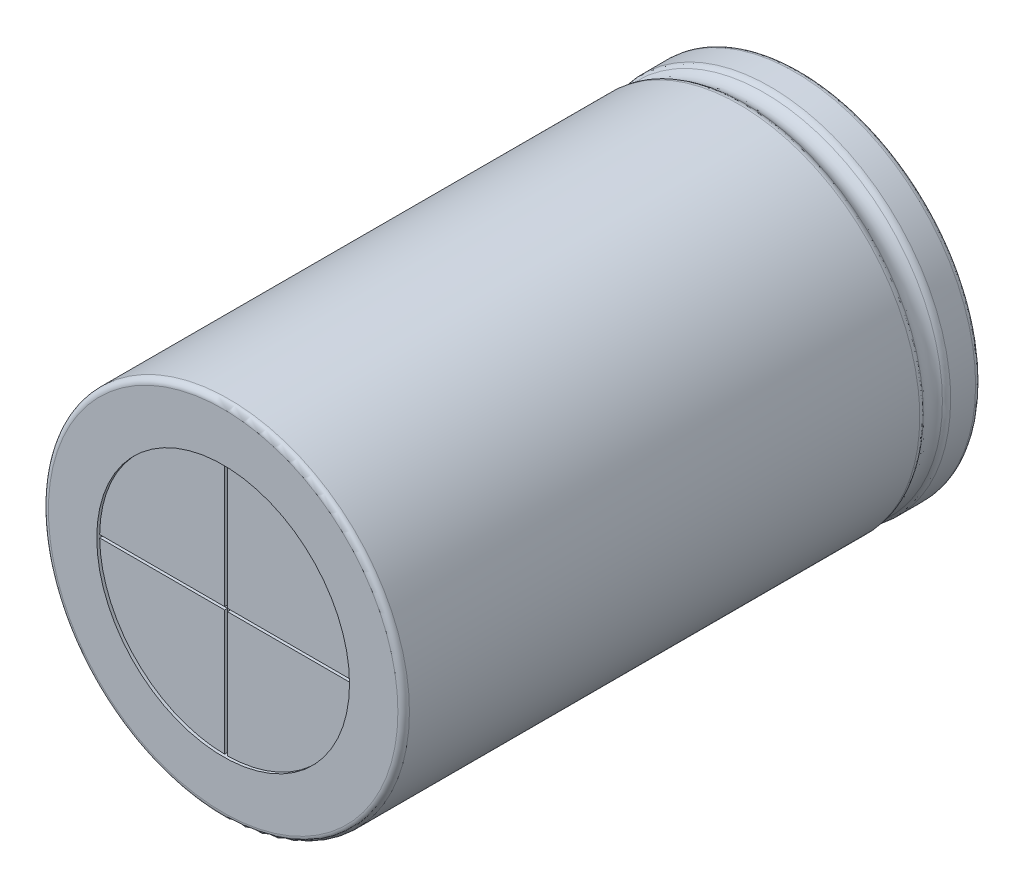
ISO-10303-21;
HEADER;
FILE_DESCRIPTION(('STEP AP214'),'2;1');
FILE_NAME('part.step','',(''),(''),'','','');
FILE_SCHEMA(('AUTOMOTIVE_DESIGN { 1 0 10303 214 1 1 1 1 }'));
ENDSEC;
DATA;
#1=APPLICATION_CONTEXT('core data for automotive mechanical design processes');
#2=APPLICATION_PROTOCOL_DEFINITION('international standard','automotive_design',2000,#1);
#3=PRODUCT_CONTEXT('',#1,'mechanical');
#4=PRODUCT('Part','Part','',(#3));
#5=PRODUCT_RELATED_PRODUCT_CATEGORY('part','',(#4));
#6=PRODUCT_DEFINITION_FORMATION('','',#4);
#7=PRODUCT_DEFINITION_CONTEXT('part definition',#1,'design');
#8=PRODUCT_DEFINITION('design','',#6,#7);
#9=PRODUCT_DEFINITION_SHAPE('','',#8);
#10=(LENGTH_UNIT() NAMED_UNIT(*) SI_UNIT(.MILLI.,.METRE.));
#11=(NAMED_UNIT(*) PLANE_ANGLE_UNIT() SI_UNIT($,.RADIAN.));
#12=(NAMED_UNIT(*) SI_UNIT($,.STERADIAN.) SOLID_ANGLE_UNIT());
#13=UNCERTAINTY_MEASURE_WITH_UNIT(LENGTH_MEASURE(1.E-05),#10,'distance_accuracy_value','');
#14=(GEOMETRIC_REPRESENTATION_CONTEXT(3) GLOBAL_UNCERTAINTY_ASSIGNED_CONTEXT((#13)) GLOBAL_UNIT_ASSIGNED_CONTEXT((#10,
#11,#12)) REPRESENTATION_CONTEXT('',''));
#15=CARTESIAN_POINT('',(0.,0.,0.));
#16=DIRECTION('',(0.,0.,1.));
#17=DIRECTION('',(1.,0.,0.));
#18=AXIS2_PLACEMENT_3D('',#15,#16,#17);
#19=CARTESIAN_POINT('',(5.,0.,-1.9));
#20=DIRECTION('',(0.,0.,1.));
#21=DIRECTION('',(1.,0.,0.));
#22=AXIS2_PLACEMENT_3D('',#19,#20,#21);
#23=PLANE('',#22);
#24=CARTESIAN_POINT('',(5.,0.,-1.9));
#25=DIRECTION('',(0.,0.,1.));
#26=DIRECTION('',(-1.,0.,0.));
#27=AXIS2_PLACEMENT_3D('',#24,#25,#26);
#28=CIRCLE('',#27,0.3);
#29=CARTESIAN_POINT('',(4.7,0.,-1.9));
#30=VERTEX_POINT('',#29);
#31=EDGE_CURVE('E30',#30,#30,#28,.T.);
#32=ORIENTED_EDGE('',*,*,#31,.F.);
#33=EDGE_LOOP('',(#32));
#34=FACE_BOUND('',#33,.T.);
#35=ADVANCED_FACE('F17',(#34),#23,.F.);
#36=CARTESIAN_POINT('',(5.,0.,0.3));
#37=DIRECTION('',(0.,0.,1.));
#38=DIRECTION('',(-1.,0.,0.));
#39=AXIS2_PLACEMENT_3D('',#36,#37,#38);
#40=CYLINDRICAL_SURFACE('',#39,0.3);
#41=CARTESIAN_POINT('',(5.,0.,0.2));
#42=DIRECTION('',(0.,0.,1.));
#43=DIRECTION('',(-1.,0.,0.));
#44=AXIS2_PLACEMENT_3D('',#41,#42,#43);
#45=CIRCLE('',#44,0.3);
#46=CARTESIAN_POINT('',(4.7,0.,0.2));
#47=VERTEX_POINT('',#46);
#48=EDGE_CURVE('E261',#47,#47,#45,.T.);
#49=ORIENTED_EDGE('',*,*,#48,.F.);
#50=DIRECTION('',(0.,0.,-1.));
#51=VECTOR('',#50,1.);
#52=CARTESIAN_POINT('',(4.7,0.,0.3));
#53=LINE('',#52,#51);
#54=EDGE_CURVE('E10',#47,#30,#53,.T.);
#55=ORIENTED_EDGE('',*,*,#54,.T.);
#56=ORIENTED_EDGE('',*,*,#31,.T.);
#57=ORIENTED_EDGE('',*,*,#54,.F.);
#58=EDGE_LOOP('',(#49,#55,#56,#57));
#59=FACE_BOUND('',#58,.T.);
#60=ADVANCED_FACE('F326',(#59),#40,.T.);
#61=CARTESIAN_POINT('',(2.5,0.,0.2));
#62=DIRECTION('',(0.,0.,1.));
#63=DIRECTION('',(1.,0.,0.));
#64=AXIS2_PLACEMENT_3D('',#61,#62,#63);
#65=PLANE('',#64);
#66=CARTESIAN_POINT('',(2.5,0.,0.2));
#67=DIRECTION('',(0.,0.,1.));
#68=DIRECTION('',(1.,0.,0.));
#69=AXIS2_PLACEMENT_3D('',#66,#67,#68);
#70=CIRCLE('',#69,4.375);
#71=CARTESIAN_POINT('',(6.875,0.,0.2));
#72=VERTEX_POINT('',#71);
#73=EDGE_CURVE('E270',#72,#72,#70,.T.);
#74=ORIENTED_EDGE('',*,*,#73,.F.);
#75=EDGE_LOOP('',(#74));
#76=FACE_BOUND('',#75,.T.);
#77=ORIENTED_EDGE('',*,*,#48,.T.);
#78=EDGE_LOOP('',(#77));
#79=FACE_BOUND('',#78,.T.);
#80=CARTESIAN_POINT('',(0.,0.,0.2));
#81=DIRECTION('',(0.,0.,1.));
#82=DIRECTION('',(-1.,0.,0.));
#83=AXIS2_PLACEMENT_3D('',#80,#81,#82);
#84=CIRCLE('',#83,0.3);
#85=CARTESIAN_POINT('',(-0.3,0.,0.2));
#86=VERTEX_POINT('',#85);
#87=EDGE_CURVE('E258',#86,#86,#84,.T.);
#88=ORIENTED_EDGE('',*,*,#87,.T.);
#89=EDGE_LOOP('',(#88));
#90=FACE_BOUND('',#89,.T.);
#91=ADVANCED_FACE('F329',(#76,#79,#90),#65,.F.);
#92=CARTESIAN_POINT('',(2.5,0.,0.3));
#93=DIRECTION('',(0.,0.,-1.));
#94=DIRECTION('',(1.,0.,0.));
#95=AXIS2_PLACEMENT_3D('',#92,#93,#94);
#96=CYLINDRICAL_SURFACE('',#95,4.375);
#97=DIRECTION('',(0.,0.,-1.));
#98=VECTOR('',#97,1.);
#99=CARTESIAN_POINT('',(6.875,0.,0.3));
#100=LINE('',#99,#98);
#101=CARTESIAN_POINT('',(6.875,0.,0.));
#102=VERTEX_POINT('',#101);
#103=EDGE_CURVE('E262',#72,#102,#100,.T.);
#104=ORIENTED_EDGE('',*,*,#103,.T.);
#105=CARTESIAN_POINT('',(2.5,0.,0.));
#106=DIRECTION('',(0.,0.,-1.));
#107=DIRECTION('',(1.,0.,0.));
#108=AXIS2_PLACEMENT_3D('',#105,#106,#107);
#109=CIRCLE('',#108,4.375);
#110=EDGE_CURVE('E798',#102,#102,#109,.T.);
#111=ORIENTED_EDGE('',*,*,#110,.T.);
#112=ORIENTED_EDGE('',*,*,#103,.F.);
#113=ORIENTED_EDGE('',*,*,#73,.T.);
#114=EDGE_LOOP('',(#104,#111,#112,#113));
#115=FACE_BOUND('',#114,.T.);
#116=ADVANCED_FACE('F380',(#115),#96,.F.);
#117=CARTESIAN_POINT('',(0.,0.,0.3));
#118=DIRECTION('',(0.,0.,1.));
#119=DIRECTION('',(-1.,0.,0.));
#120=AXIS2_PLACEMENT_3D('',#117,#118,#119);
#121=CYLINDRICAL_SURFACE('',#120,0.3);
#122=ORIENTED_EDGE('',*,*,#87,.F.);
#123=DIRECTION('',(0.,0.,-1.));
#124=VECTOR('',#123,1.);
#125=CARTESIAN_POINT('',(-0.3,0.,0.3));
#126=LINE('',#125,#124);
#127=CARTESIAN_POINT('',(-0.3,0.,-2.));
#128=VERTEX_POINT('',#127);
#129=EDGE_CURVE('E266',#86,#128,#126,.T.);
#130=ORIENTED_EDGE('',*,*,#129,.T.);
#131=CARTESIAN_POINT('',(0.,0.,-2.));
#132=DIRECTION('',(0.,0.,1.));
#133=DIRECTION('',(-1.,0.,0.));
#134=AXIS2_PLACEMENT_3D('',#131,#132,#133);
#135=CIRCLE('',#134,0.3);
#136=EDGE_CURVE('E271',#128,#128,#135,.T.);
#137=ORIENTED_EDGE('',*,*,#136,.T.);
#138=ORIENTED_EDGE('',*,*,#129,.F.);
#139=EDGE_LOOP('',(#122,#130,#137,#138));
#140=FACE_BOUND('',#139,.T.);
#141=ADVANCED_FACE('F362',(#140),#121,.T.);
#142=CARTESIAN_POINT('',(2.5,0.,0.));
#143=DIRECTION('',(0.,0.,-1.));
#144=DIRECTION('',(0.,-1.,0.));
#145=AXIS2_PLACEMENT_3D('',#142,#143,#144);
#146=PLANE('',#145);
#147=ORIENTED_EDGE('',*,*,#110,.F.);
#148=EDGE_LOOP('',(#147));
#149=FACE_BOUND('',#148,.T.);
#150=CARTESIAN_POINT('',(2.5,0.,0.));
#151=DIRECTION('',(0.,0.,-1.));
#152=DIRECTION('',(1.,0.,0.));
#153=AXIS2_PLACEMENT_3D('',#150,#151,#152);
#154=CIRCLE('',#153,6.05);
#155=CARTESIAN_POINT('',(8.55,0.,0.));
#156=VERTEX_POINT('',#155);
#157=EDGE_CURVE('E812',#156,#156,#154,.T.);
#158=ORIENTED_EDGE('',*,*,#157,.T.);
#159=EDGE_LOOP('',(#158));
#160=FACE_BOUND('',#159,.T.);
#161=ADVANCED_FACE('F346',(#149,#160),#146,.T.);
#162=CARTESIAN_POINT('',(0.,0.,-2.));
#163=DIRECTION('',(0.,0.,1.));
#164=DIRECTION('',(1.,0.,0.));
#165=AXIS2_PLACEMENT_3D('',#162,#163,#164);
#166=PLANE('',#165);
#167=ORIENTED_EDGE('',*,*,#136,.F.);
#168=EDGE_LOOP('',(#167));
#169=FACE_BOUND('',#168,.T.);
#170=ADVANCED_FACE('F306',(#169),#166,.F.);
#171=CARTESIAN_POINT('',(8.55,0.,0.));
#172=CARTESIAN_POINT('',(8.66715728752538,0.,0.));
#173=CARTESIAN_POINT('',(8.75000000000001,0.,0.0828427124746187));
#174=CARTESIAN_POINT('',(8.75,0.,0.2));
#175=(BOUNDED_CURVE() B_SPLINE_CURVE(3,(#171,#172,#173,#174),.UNSPECIFIED.,.F.,
.F.) B_SPLINE_CURVE_WITH_KNOTS((4,4),(0.,1.),
.UNSPECIFIED.) CURVE() GEOMETRIC_REPRESENTATION_ITEM() RATIONAL_B_SPLINE_CURVE((1.,
0.804737854124364,0.804737854124364,1.)) REPRESENTATION_ITEM(''));
#176=CARTESIAN_POINT('',(2.5,0.,0.));
#177=DIRECTION('',(0.,0.,1.));
#178=AXIS1_PLACEMENT('',#176,#177);
#179=SURFACE_OF_REVOLUTION('',#175,#178);
#180=CARTESIAN_POINT('',(8.55,0.,0.2));
#181=DIRECTION('',(0.,-1.,0.));
#182=DIRECTION('',(0.,0.,-1.));
#183=AXIS2_PLACEMENT_3D('',#180,#181,#182);
#184=CIRCLE('',#183,0.2);
#185=CARTESIAN_POINT('',(8.75,0.,0.2));
#186=VERTEX_POINT('',#185);
#187=EDGE_CURVE('E808',#156,#186,#184,.T.);
#188=ORIENTED_EDGE('',*,*,#187,.T.);
#189=CARTESIAN_POINT('',(2.5,0.,0.2));
#190=DIRECTION('',(0.,0.,-1.));
#191=DIRECTION('',(1.,0.,0.));
#192=AXIS2_PLACEMENT_3D('',#189,#190,#191);
#193=CIRCLE('',#192,6.25);
#194=EDGE_CURVE('E813',#186,#186,#193,.T.);
#195=ORIENTED_EDGE('',*,*,#194,.T.);
#196=ORIENTED_EDGE('',*,*,#187,.F.);
#197=ORIENTED_EDGE('',*,*,#157,.F.);
#198=EDGE_LOOP('',(#188,#195,#196,#197));
#199=FACE_BOUND('',#198,.T.);
#200=ADVANCED_FACE('F302',(#199),#179,.T.);
#201=CARTESIAN_POINT('',(2.5,0.,0.2));
#202=DIRECTION('',(0.,0.,1.));
#203=DIRECTION('',(1.,0.,0.));
#204=AXIS2_PLACEMENT_3D('',#201,#202,#203);
#205=CYLINDRICAL_SURFACE('',#204,6.25);
#206=CARTESIAN_POINT('',(8.75,0.,1.064979142851));
#207=CARTESIAN_POINT('',(8.750000000002,-2.764417237131,1.064979142851));
#208=CARTESIAN_POINT('',(7.433450299616,-5.587680207856,1.064979142851));
#209=CARTESIAN_POINT('',(4.70751089804,-7.733925513798,1.064979142851));
#210=CARTESIAN_POINT('',(0.989525682896,-8.439508903971,1.064979142851));
#211=CARTESIAN_POINT('',(-2.86187936145,-7.042866187248,1.064979142851));
#212=CARTESIAN_POINT('',(-5.445545223467,-4.277607477121,1.064979142852));
#213=CARTESIAN_POINT('',(-7.07999725837,3.246155275231E-11,1.064979142851));
#214=CARTESIAN_POINT('',(-5.44554522347,4.277607477066,1.064979142852));
#215=CARTESIAN_POINT('',(-2.86187936145,7.042866187284,1.064979142851));
#216=CARTESIAN_POINT('',(0.989525682902,8.439508903953,1.064979142851));
#217=CARTESIAN_POINT('',(4.707510898034,7.733925513807,1.064979142851));
#218=CARTESIAN_POINT('',(7.43345029962,5.587680207852,1.064979142851));
#219=CARTESIAN_POINT('',(8.750000000001,2.764417237132,1.064979142851));
#220=CARTESIAN_POINT('',(8.75,0.,1.064979142851));
#221=(BOUNDED_CURVE() B_SPLINE_CURVE(14,(#206,#207,#208,#209,#210,#211,#212,#213,#214,#215,#216,
#217,#218,#219,#220),.UNSPECIFIED.,.T.,.F.) B_SPLINE_CURVE_WITH_KNOTS((15,15),(0.,
39.269908169872),
.UNSPECIFIED.) CURVE() GEOMETRIC_REPRESENTATION_ITEM() RATIONAL_B_SPLINE_CURVE((1.,1.,1.,1.,1.,
1.,1.,1.,1.,1.,1.,1.,1.,1.,1.)) REPRESENTATION_ITEM(''));
#222=CARTESIAN_POINT('',(8.75,0.,1.064979142851));
#223=VERTEX_POINT('',#222);
#224=EDGE_CURVE('E254',#223,#223,#221,.T.);
#225=ORIENTED_EDGE('',*,*,#224,.T.);
#226=DIRECTION('',(0.,0.,1.));
#227=VECTOR('',#226,1.);
#228=CARTESIAN_POINT('',(8.75,0.,0.2));
#229=LINE('',#228,#227);
#230=EDGE_CURVE('E282',#186,#223,#229,.T.);
#231=ORIENTED_EDGE('',*,*,#230,.F.);
#232=ORIENTED_EDGE('',*,*,#194,.F.);
#233=ORIENTED_EDGE('',*,*,#230,.T.);
#234=EDGE_LOOP('',(#225,#231,#232,#233));
#235=FACE_BOUND('',#234,.T.);
#236=ADVANCED_FACE('F305',(#235),#205,.T.);
#237=CARTESIAN_POINT('',(8.75,0.,1.064979142851));
#238=CARTESIAN_POINT('',(8.750000000002,-2.764417237131,1.064979142851));
#239=CARTESIAN_POINT('',(7.433450299616,-5.587680207856,1.064979142851));
#240=CARTESIAN_POINT('',(4.70751089804,-7.733925513798,1.064979142851));
#241=CARTESIAN_POINT('',(0.989525682896,-8.439508903971,1.064979142851));
#242=CARTESIAN_POINT('',(-2.86187936145,-7.042866187248,1.064979142851));
#243=CARTESIAN_POINT('',(-5.445545223467,-4.277607477121,1.064979142852));
#244=CARTESIAN_POINT('',(-7.07999725837,3.246155275231E-11,1.064979142851));
#245=CARTESIAN_POINT('',(-5.44554522347,4.277607477066,1.064979142852));
#246=CARTESIAN_POINT('',(-2.86187936145,7.04286618728401,1.064979142851));
#247=CARTESIAN_POINT('',(0.989525682902,8.439508903953,1.064979142851));
#248=CARTESIAN_POINT('',(4.707510898034,7.733925513807,1.064979142851));
#249=CARTESIAN_POINT('',(7.43345029962,5.587680207852,1.064979142851));
#250=CARTESIAN_POINT('',(8.750000000001,2.764417237132,1.064979142851));
#251=CARTESIAN_POINT('',(8.75,0.,1.064979142851));
#252=CARTESIAN_POINT('',(8.75,0.,1.182962690499));
#253=CARTESIAN_POINT('',(8.750000000003,-2.764417237131,1.182962690499));
#254=CARTESIAN_POINT('',(7.433450299614,-5.58768020785301,1.182962690499));
#255=CARTESIAN_POINT('',(4.707510898044,-7.733925513809,1.182962690499));
#256=CARTESIAN_POINT('',(0.9895256829,-8.439508903947,1.182962690499));
#257=CARTESIAN_POINT('',(-2.861879361473,-7.04286618728,1.182962690499));
#258=CARTESIAN_POINT('',(-5.445545223421,-4.2776074771,1.1829626905));
#259=CARTESIAN_POINT('',(-7.079997258428,4.280073278527E-11,1.182962690499));
#260=CARTESIAN_POINT('',(-5.44554522343,4.277607477027,1.1829626905));
#261=CARTESIAN_POINT('',(-2.861879361466,7.042866187327,1.182962690499));
#262=CARTESIAN_POINT('',(0.989525682901001,8.439508903922,1.182962690499));
#263=CARTESIAN_POINT('',(4.707510898039,7.733925513821,1.182962690499));
#264=CARTESIAN_POINT('',(7.433450299616,5.587680207848,1.182962690499));
#265=CARTESIAN_POINT('',(8.750000000002,2.764417237132,1.182962690499));
#266=CARTESIAN_POINT('',(8.75,0.,1.182962690499));
#267=CARTESIAN_POINT('',(8.669629897377,0.,1.269338405373));
#268=CARTESIAN_POINT('',(8.669629897379,-2.728868997603,1.269338405373));
#269=CARTESIAN_POINT('',(7.370009994517,-5.515827018781,1.269338405373));
#270=CARTESIAN_POINT('',(4.679124037655,-7.634473291834,1.269338405373));
#271=CARTESIAN_POINT('',(1.008949199032,-8.33098343251801,1.269338405373));
#272=CARTESIAN_POINT('',(-2.792929794315,-6.952300446695,1.269338405372));
#273=CARTESIAN_POINT('',(-5.343371737881,-4.222600796868,1.269338405374));
#274=CARTESIAN_POINT('',(-6.956806000305,9.793981203629E-11,1.269338405371));
#275=CARTESIAN_POINT('',(-5.343371737887,4.222600796693,1.269338405374));
#276=CARTESIAN_POINT('',(-2.79292979431,6.952300446821,1.269338405372));
#277=CARTESIAN_POINT('',(1.008949199033,8.330983432445,1.269338405373));
#278=CARTESIAN_POINT('',(4.679124037651,7.634473291869,1.269338405373));
#279=CARTESIAN_POINT('',(7.370009994519,5.515827018768,1.269338405373));
#280=CARTESIAN_POINT('',(8.669629897378,2.728868997606,1.269338405373));
#281=CARTESIAN_POINT('',(8.669629897377,0.,1.269338405373));
#282=(BOUNDED_SURFACE() B_SPLINE_SURFACE(2,14,((#237,#238,#239,#240,#241,#242,#243,#244,#245,
#246,#247,#248,#249,#250,#251),(#252,#253,#254,#255,#256,#257,#258,#259,#260,#261,#262,#263,
#264,#265,#266),(#267,#268,#269,#270,#271,#272,#273,#274,#275,#276,#277,#278,#279,#280,#281)),
.UNSPECIFIED.,.F.,.T.,.F.) B_SPLINE_SURFACE_WITH_KNOTS((3,3),(15,15),(0.,39.269908169872),(0.,
39.269908169872),.UNSPECIFIED.) GEOMETRIC_REPRESENTATION_ITEM() RATIONAL_B_SPLINE_SURFACE(((1.,
1.,1.,0.999999999999,1.000000000003,0.999999999996,1.000000000004,0.999999999996,1.000000000003,
0.999999999998,1.000000000001,1.,1.,1.,1.),(0.93061798229,0.930617982289,0.930617982291,
0.930617982287,0.930617982295,0.930617982282,0.9306179823,0.930617982279,0.930617982299,
0.930617982283,0.930617982293,0.930617982288,0.93061798229,0.93061798229,0.93061798229),(1.,1.,
1.,0.999999999999,1.000000000003,0.999999999996,1.000000000004,0.999999999996,1.000000000003,
0.999999999998,1.000000000001,1.,1.,1.,1.))) REPRESENTATION_ITEM('') SURFACE());
#283=CARTESIAN_POINT('',(8.75,0.,1.064979142851));
#284=CARTESIAN_POINT('',(8.75,0.,1.182962690499));
#285=CARTESIAN_POINT('',(8.669629897377,0.,1.269338405373));
#286=(BOUNDED_CURVE() B_SPLINE_CURVE(2,(#283,#284,#285),.UNSPECIFIED.,.F.,
.F.) B_SPLINE_CURVE_WITH_KNOTS((3,3),(0.,39.269908169872),
.UNSPECIFIED.) CURVE() GEOMETRIC_REPRESENTATION_ITEM() RATIONAL_B_SPLINE_CURVE((1.,
0.93061798229,1.)) REPRESENTATION_ITEM(''));
#287=CARTESIAN_POINT('',(8.669629897377,0.,1.269338405373));
#288=VERTEX_POINT('',#287);
#289=EDGE_CURVE('E285',#223,#288,#286,.T.);
#290=CARTESIAN_POINT('',(8.669629897377,0.,1.269338405373));
#291=CARTESIAN_POINT('',(8.669629897379,-2.728868997603,1.269338405373));
#292=CARTESIAN_POINT('',(7.370009994517,-5.515827018781,1.269338405373));
#293=CARTESIAN_POINT('',(4.679124037655,-7.634473291834,1.269338405373));
#294=CARTESIAN_POINT('',(1.008949199032,-8.330983432518,1.269338405373));
#295=CARTESIAN_POINT('',(-2.792929794315,-6.952300446695,1.269338405372));
#296=CARTESIAN_POINT('',(-5.343371737881,-4.222600796868,1.269338405374));
#297=CARTESIAN_POINT('',(-6.956806000305,9.793981203629E-11,1.269338405371));
#298=CARTESIAN_POINT('',(-5.343371737887,4.222600796693,1.269338405374));
#299=CARTESIAN_POINT('',(-2.79292979431,6.952300446821,1.269338405372));
#300=CARTESIAN_POINT('',(1.008949199033,8.330983432445,1.269338405373));
#301=CARTESIAN_POINT('',(4.679124037651,7.634473291869,1.269338405373));
#302=CARTESIAN_POINT('',(7.370009994519,5.515827018768,1.269338405373));
#303=CARTESIAN_POINT('',(8.669629897378,2.728868997606,1.269338405373));
#304=CARTESIAN_POINT('',(8.669629897377,0.,1.269338405373));
#305=(BOUNDED_CURVE() B_SPLINE_CURVE(14,(#290,#291,#292,#293,#294,#295,#296,#297,#298,#299,#300,
#301,#302,#303,#304),.UNSPECIFIED.,.T.,.F.) B_SPLINE_CURVE_WITH_KNOTS((15,15),(0.,
39.269908169872),
.UNSPECIFIED.) CURVE() GEOMETRIC_REPRESENTATION_ITEM() RATIONAL_B_SPLINE_CURVE((1.,1.,1.,1.,1.,
1.,1.,1.,1.,1.,1.,1.,1.,1.,1.)) REPRESENTATION_ITEM(''));
#306=EDGE_CURVE('E829',#288,#288,#305,.T.);
#307=ORIENTED_EDGE('',*,*,#289,.T.);
#308=ORIENTED_EDGE('',*,*,#306,.T.);
#309=ORIENTED_EDGE('',*,*,#289,.F.);
#310=ORIENTED_EDGE('',*,*,#224,.F.);
#311=EDGE_LOOP('',(#307,#308,#309,#310));
#312=FACE_BOUND('',#311,.T.);
#313=ADVANCED_FACE('F371',(#312),#282,.T.);
#314=CARTESIAN_POINT('',(8.67262203769535,0.,1.26615157379086));
#315=CARTESIAN_POINT('',(8.48532955396172,0.,1.46383932245703));
#316=CARTESIAN_POINT('',(8.48532955396171,0.,1.73616067754291));
#317=CARTESIAN_POINT('',(8.67262203769531,0.,1.93384842620911));
#318=(BOUNDED_CURVE() B_SPLINE_CURVE(3,(#314,#315,#316,#317),.UNSPECIFIED.,.F.,
.F.) B_SPLINE_CURVE_WITH_KNOTS((4,4),(0.,1.),
.UNSPECIFIED.) CURVE() GEOMETRIC_REPRESENTATION_ITEM() RATIONAL_B_SPLINE_CURVE((1.,
0.817290356838013,0.817290356838013,1.)) REPRESENTATION_ITEM(''));
#319=CARTESIAN_POINT('',(2.5,0.,0.));
#320=DIRECTION('',(0.,0.,1.));
#321=AXIS1_PLACEMENT('',#319,#320);
#322=SURFACE_OF_REVOLUTION('',#318,#321);
#323=CARTESIAN_POINT('',(8.669629897377,0.,1.930661594627));
#324=CARTESIAN_POINT('',(8.669629897378,-2.728868997603,1.930661594627));
#325=CARTESIAN_POINT('',(7.37000999452,-5.515827018781,1.930661594627));
#326=CARTESIAN_POINT('',(4.679124037647,-7.634473291834,1.930661594627));
#327=CARTESIAN_POINT('',(1.008949199049,-8.330983432516,1.930661594627));
#328=CARTESIAN_POINT('',(-2.792929794344,-6.952300446701,1.930661594628));
#329=CARTESIAN_POINT('',(-5.343371737842,-4.222600796857,1.930661594627));
#330=CARTESIAN_POINT('',(-6.956806000346,8.190108613334E-11,1.930661594628));
#331=CARTESIAN_POINT('',(-5.343371737851,4.222600796711,1.930661594627));
#332=CARTESIAN_POINT('',(-2.792929794336,6.952300446804,1.930661594628));
#333=CARTESIAN_POINT('',(1.008949199048,8.330983432457,1.930661594627));
#334=CARTESIAN_POINT('',(4.679124037644,7.634473291862,1.930661594627));
#335=CARTESIAN_POINT('',(7.370009994522,5.51582701877,1.930661594627));
#336=CARTESIAN_POINT('',(8.669629897377,2.728868997606,1.930661594627));
#337=CARTESIAN_POINT('',(8.669629897377,0.,1.930661594627));
#338=(BOUNDED_CURVE() B_SPLINE_CURVE(14,(#323,#324,#325,#326,#327,#328,#329,#330,#331,#332,#333,
#334,#335,#336,#337),.UNSPECIFIED.,.T.,.F.) B_SPLINE_CURVE_WITH_KNOTS((15,15),(0.,
39.269908169872),
.UNSPECIFIED.) CURVE() GEOMETRIC_REPRESENTATION_ITEM() RATIONAL_B_SPLINE_CURVE((1.,1.,1.,1.,1.,
1.,1.,1.,1.,1.,1.,1.,1.,1.,1.)) REPRESENTATION_ITEM(''));
#339=CARTESIAN_POINT('',(8.669629897377,0.,1.930661594627));
#340=VERTEX_POINT('',#339);
#341=EDGE_CURVE('E289',#340,#340,#338,.T.);
#342=ORIENTED_EDGE('',*,*,#341,.T.);
#343=CARTESIAN_POINT('',(9.025,0.,1.6));
#344=DIRECTION('',(0.,1.,0.));
#345=DIRECTION('',(-0.566528822887193,0.,-0.82404192419928));
#346=AXIS2_PLACEMENT_3D('',#343,#344,#345);
#347=CIRCLE('',#346,0.485412195974);
#348=EDGE_CURVE('E286',#288,#340,#347,.T.);
#349=ORIENTED_EDGE('',*,*,#348,.F.);
#350=ORIENTED_EDGE('',*,*,#306,.F.);
#351=ORIENTED_EDGE('',*,*,#348,.T.);
#352=EDGE_LOOP('',(#342,#349,#350,#351));
#353=FACE_BOUND('',#352,.T.);
#354=ADVANCED_FACE('F19',(#353),#322,.T.);
#355=CARTESIAN_POINT('',(8.669629897377,0.,1.930661594627));
#356=CARTESIAN_POINT('',(8.669629897378,-2.728868997603,1.930661594627));
#357=CARTESIAN_POINT('',(7.37000999452,-5.515827018781,1.930661594627));
#358=CARTESIAN_POINT('',(4.679124037647,-7.634473291834,1.930661594627));
#359=CARTESIAN_POINT('',(1.008949199049,-8.330983432516,1.930661594627));
#360=CARTESIAN_POINT('',(-2.792929794344,-6.952300446701,1.930661594628));
#361=CARTESIAN_POINT('',(-5.343371737842,-4.222600796857,1.930661594627));
#362=CARTESIAN_POINT('',(-6.956806000346,8.190108613334E-11,1.930661594628));
#363=CARTESIAN_POINT('',(-5.343371737851,4.222600796711,1.930661594627));
#364=CARTESIAN_POINT('',(-2.792929794336,6.952300446804,1.930661594628));
#365=CARTESIAN_POINT('',(1.008949199048,8.330983432457,1.930661594627));
#366=CARTESIAN_POINT('',(4.679124037644,7.634473291862,1.930661594627));
#367=CARTESIAN_POINT('',(7.370009994522,5.51582701877,1.930661594627));
#368=CARTESIAN_POINT('',(8.669629897377,2.728868997606,1.930661594627));
#369=CARTESIAN_POINT('',(8.669629897377,0.,1.930661594627));
#370=CARTESIAN_POINT('',(8.75,0.,2.017037309501));
#371=CARTESIAN_POINT('',(8.750000000002,-2.764417237131,2.017037309501));
#372=CARTESIAN_POINT('',(7.433450299615,-5.58768020785,2.017037309501));
#373=CARTESIAN_POINT('',(4.70751089804,-7.733925513817,2.017037309501));
#374=CARTESIAN_POINT('',(0.989525682909,-8.43950890393,2.017037309501));
#375=CARTESIAN_POINT('',(-2.86187936149,-7.042866187307,2.017037309501));
#376=CARTESIAN_POINT('',(-5.445545223398,-4.277607477065,2.017037309501));
#377=CARTESIAN_POINT('',(-7.079997258454,6.518355509061E-12,2.0170373095));
#378=CARTESIAN_POINT('',(-5.445545223407,4.277607477058,2.017037309501));
#379=CARTESIAN_POINT('',(-2.861879361483,7.04286618730601,2.0170373095));
#380=CARTESIAN_POINT('',(0.989525682911,8.439508903934,2.017037309501));
#381=CARTESIAN_POINT('',(4.707510898035,7.733925513815,2.017037309501));
#382=CARTESIAN_POINT('',(7.433450299618,5.58768020784901,2.017037309501));
#383=CARTESIAN_POINT('',(8.750000000001,2.764417237132,2.017037309501));
#384=CARTESIAN_POINT('',(8.75,0.,2.017037309501));
#385=CARTESIAN_POINT('',(8.75,0.,2.135020857149));
#386=CARTESIAN_POINT('',(8.750000000001,-2.764417237131,2.135020857149));
#387=CARTESIAN_POINT('',(7.433450299618,-5.587680207854,2.135020857149));
#388=CARTESIAN_POINT('',(4.707510898034,-7.733925513804,2.135020857149));
#389=CARTESIAN_POINT('',(0.989525682908001,-8.43950890396,2.135020857149));
#390=CARTESIAN_POINT('',(-2.861879361468,-7.042866187266,2.135020857149));
#391=CARTESIAN_POINT('',(-5.445545223446,-4.277607477099,2.135020857149));
#392=CARTESIAN_POINT('',(-7.07999725839,9.79346312472501E-12,2.135020857149));
#393=CARTESIAN_POINT('',(-5.445545223453,4.277607477085,2.135020857149));
#394=CARTESIAN_POINT('',(-2.861879361462,7.042866187271,2.135020857148));
#395=CARTESIAN_POINT('',(0.989525682909,8.43950890396,2.135020857149));
#396=CARTESIAN_POINT('',(4.70751089803,7.733925513804,2.135020857149));
#397=CARTESIAN_POINT('',(7.433450299621,5.587680207852,2.135020857149));
#398=CARTESIAN_POINT('',(8.750000000001,2.764417237132,2.135020857149));
#399=CARTESIAN_POINT('',(8.75,0.,2.135020857149));
#400=(BOUNDED_SURFACE() B_SPLINE_SURFACE(2,14,((#355,#356,#357,#358,#359,#360,#361,#362,#363,
#364,#365,#366,#367,#368,#369),(#370,#371,#372,#373,#374,#375,#376,#377,#378,#379,#380,#381,
#382,#383,#384),(#385,#386,#387,#388,#389,#390,#391,#392,#393,#394,#395,#396,#397,#398,#399)),
.UNSPECIFIED.,.F.,.T.,.F.) B_SPLINE_SURFACE_WITH_KNOTS((3,3),(15,15),(0.,39.269908169872),(0.,
39.269908169872),.UNSPECIFIED.) GEOMETRIC_REPRESENTATION_ITEM() RATIONAL_B_SPLINE_SURFACE(((1.,
1.,1.,0.999999999999,1.000000000003,0.999999999996,1.000000000004,0.999999999996,1.000000000003,
0.999999999998,1.000000000001,1.,1.,1.,1.),(0.93061798229,0.930617982289,0.930617982291,
0.930617982287,0.930617982295,0.930617982282,0.9306179823,0.930617982279,0.930617982299,
0.930617982283,0.930617982293,0.930617982288,0.93061798229,0.93061798229,0.93061798229),(1.,1.,
1.,0.999999999999,1.000000000003,0.999999999996,1.000000000004,0.999999999996,1.000000000003,
0.999999999998,1.000000000001,1.,1.,1.,1.))) REPRESENTATION_ITEM('') SURFACE());
#401=CARTESIAN_POINT('',(8.669629897377,0.,1.930661594627));
#402=CARTESIAN_POINT('',(8.75,0.,2.017037309501));
#403=CARTESIAN_POINT('',(8.75,0.,2.135020857149));
#404=(BOUNDED_CURVE() B_SPLINE_CURVE(2,(#401,#402,#403),.UNSPECIFIED.,.F.,
.F.) B_SPLINE_CURVE_WITH_KNOTS((3,3),(0.,39.269908169872),
.UNSPECIFIED.) CURVE() GEOMETRIC_REPRESENTATION_ITEM() RATIONAL_B_SPLINE_CURVE((1.,
0.93061798229,1.)) REPRESENTATION_ITEM(''));
#405=CARTESIAN_POINT('',(8.75,0.,2.135020857149));
#406=VERTEX_POINT('',#405);
#407=EDGE_CURVE('E290',#340,#406,#404,.T.);
#408=CARTESIAN_POINT('',(8.75,0.,2.135020857149));
#409=CARTESIAN_POINT('',(8.750000000001,-2.764417237131,2.135020857149));
#410=CARTESIAN_POINT('',(7.433450299618,-5.587680207854,2.135020857149));
#411=CARTESIAN_POINT('',(4.707510898034,-7.733925513804,2.135020857149));
#412=CARTESIAN_POINT('',(0.989525682908,-8.43950890396,2.135020857149));
#413=CARTESIAN_POINT('',(-2.861879361468,-7.042866187266,2.135020857149));
#414=CARTESIAN_POINT('',(-5.445545223446,-4.277607477099,2.135020857149));
#415=CARTESIAN_POINT('',(-7.07999725839,9.793463124725E-12,2.135020857149));
#416=CARTESIAN_POINT('',(-5.445545223453,4.277607477085,2.135020857149));
#417=CARTESIAN_POINT('',(-2.861879361462,7.042866187271,2.135020857148));
#418=CARTESIAN_POINT('',(0.989525682909,8.43950890396,2.135020857149));
#419=CARTESIAN_POINT('',(4.70751089803,7.733925513804,2.135020857149));
#420=CARTESIAN_POINT('',(7.433450299621,5.587680207852,2.135020857149));
#421=CARTESIAN_POINT('',(8.750000000001,2.764417237132,2.135020857149));
#422=CARTESIAN_POINT('',(8.75,0.,2.135020857149));
#423=(BOUNDED_CURVE() B_SPLINE_CURVE(14,(#408,#409,#410,#411,#412,#413,#414,#415,#416,#417,#418,
#419,#420,#421,#422),.UNSPECIFIED.,.T.,.F.) B_SPLINE_CURVE_WITH_KNOTS((15,15),(0.,
39.269908169872),
.UNSPECIFIED.) CURVE() GEOMETRIC_REPRESENTATION_ITEM() RATIONAL_B_SPLINE_CURVE((1.,1.,1.,1.,1.,
1.,1.,1.,1.,1.,1.,1.,1.,1.,1.)) REPRESENTATION_ITEM(''));
#424=EDGE_CURVE('E871',#406,#406,#423,.T.);
#425=ORIENTED_EDGE('',*,*,#407,.T.);
#426=ORIENTED_EDGE('',*,*,#424,.T.);
#427=ORIENTED_EDGE('',*,*,#407,.F.);
#428=ORIENTED_EDGE('',*,*,#341,.F.);
#429=EDGE_LOOP('',(#425,#426,#427,#428));
#430=FACE_BOUND('',#429,.T.);
#431=ADVANCED_FACE('F348',(#430),#400,.T.);
#432=CARTESIAN_POINT('',(2.5,0.,2.));
#433=DIRECTION('',(0.,0.,1.));
#434=DIRECTION('',(1.,0.,0.));
#435=AXIS2_PLACEMENT_3D('',#432,#433,#434);
#436=CYLINDRICAL_SURFACE('',#435,6.25);
#437=CARTESIAN_POINT('',(2.5,0.,19.8));
#438=DIRECTION('',(0.,0.,-1.));
#439=DIRECTION('',(1.,0.,0.));
#440=AXIS2_PLACEMENT_3D('',#437,#438,#439);
#441=CIRCLE('',#440,6.25);
#442=CARTESIAN_POINT('',(8.75,0.,19.8));
#443=VERTEX_POINT('',#442);
#444=EDGE_CURVE('E867',#443,#443,#441,.T.);
#445=ORIENTED_EDGE('',*,*,#444,.T.);
#446=DIRECTION('',(0.,0.,1.));
#447=VECTOR('',#446,1.);
#448=CARTESIAN_POINT('',(8.75,0.,2.));
#449=LINE('',#448,#447);
#450=EDGE_CURVE('E294',#406,#443,#449,.T.);
#451=ORIENTED_EDGE('',*,*,#450,.F.);
#452=ORIENTED_EDGE('',*,*,#424,.F.);
#453=ORIENTED_EDGE('',*,*,#450,.T.);
#454=EDGE_LOOP('',(#445,#451,#452,#453));
#455=FACE_BOUND('',#454,.T.);
#456=ADVANCED_FACE('F353',(#455),#436,.T.);
#457=CARTESIAN_POINT('',(2.5,0.,19.8));
#458=DIRECTION('',(0.,0.,1.));
#459=DIRECTION('',(1.,0.,0.));
#460=AXIS2_PLACEMENT_3D('',#457,#458,#459);
#461=TOROIDAL_SURFACE('',#460,6.05,0.2);
#462=CARTESIAN_POINT('',(8.55,0.,19.8));
#463=DIRECTION('',(0.,-1.,0.));
#464=DIRECTION('',(1.,0.,0.));
#465=AXIS2_PLACEMENT_3D('',#462,#463,#464);
#466=CIRCLE('',#465,0.2);
#467=CARTESIAN_POINT('',(8.55,0.,20.));
#468=VERTEX_POINT('',#467);
#469=EDGE_CURVE('E291',#443,#468,#466,.T.);
#470=ORIENTED_EDGE('',*,*,#469,.T.);
#471=CARTESIAN_POINT('',(2.5,0.,20.));
#472=DIRECTION('',(0.,0.,-1.));
#473=DIRECTION('',(1.,0.,0.));
#474=AXIS2_PLACEMENT_3D('',#471,#472,#473);
#475=CIRCLE('',#474,6.05);
#476=EDGE_CURVE('E295',#468,#468,#475,.T.);
#477=ORIENTED_EDGE('',*,*,#476,.T.);
#478=ORIENTED_EDGE('',*,*,#469,.F.);
#479=ORIENTED_EDGE('',*,*,#444,.F.);
#480=EDGE_LOOP('',(#470,#477,#478,#479));
#481=FACE_BOUND('',#480,.T.);
#482=ADVANCED_FACE('F364',(#481),#461,.T.);
#483=CARTESIAN_POINT('',(2.5,0.,20.));
#484=DIRECTION('',(0.,0.,-1.));
#485=DIRECTION('',(0.,-1.,0.));
#486=AXIS2_PLACEMENT_3D('',#483,#484,#485);
#487=PLANE('',#486);
#488=ORIENTED_EDGE('',*,*,#476,.F.);
#489=EDGE_LOOP('',(#488));
#490=FACE_BOUND('',#489,.T.);
#491=CARTESIAN_POINT('',(2.5,0.,20.));
#492=DIRECTION('',(0.,0.,-1.));
#493=DIRECTION('',(1.,0.,0.));
#494=AXIS2_PLACEMENT_3D('',#491,#492,#493);
#495=CIRCLE('',#494,4.375);
#496=CARTESIAN_POINT('',(6.875,0.,20.));
#497=VERTEX_POINT('',#496);
#498=EDGE_CURVE('E797',#497,#497,#495,.T.);
#499=ORIENTED_EDGE('',*,*,#498,.T.);
#500=EDGE_LOOP('',(#499));
#501=FACE_BOUND('',#500,.T.);
#502=ADVANCED_FACE('F367',(#490,#501),#487,.F.);
#503=CARTESIAN_POINT('',(2.5,0.,20.));
#504=DIRECTION('',(0.,0.,-1.));
#505=DIRECTION('',(1.,0.,0.));
#506=AXIS2_PLACEMENT_3D('',#503,#504,#505);
#507=CYLINDRICAL_SURFACE('',#506,4.375);
#508=CARTESIAN_POINT('',(2.5,0.,19.8));
#509=DIRECTION('',(0.,0.,-1.));
#510=DIRECTION('',(-1.,0.,0.));
#511=AXIS2_PLACEMENT_3D('',#508,#509,#510);
#512=CIRCLE('',#511,4.375);
#513=CARTESIAN_POINT('',(6.875,1.704385628176E-13,19.8));
#514=VERTEX_POINT('',#513);
#515=CARTESIAN_POINT('',(6.874714276384,-0.05,19.8));
#516=VERTEX_POINT('',#515);
#517=EDGE_CURVE('E265',#514,#516,#512,.T.);
#518=ORIENTED_EDGE('',*,*,#517,.T.);
#519=DIRECTION('',(0.,0.,-1.));
#520=VECTOR('',#519,1.);
#521=CARTESIAN_POINT('',(6.874714276384,-0.05,19.7));
#522=LINE('',#521,#520);
#523=CARTESIAN_POINT('',(6.874714276384,-0.05,19.9));
#524=VERTEX_POINT('',#523);
#525=EDGE_CURVE('E776',#524,#516,#522,.T.);
#526=ORIENTED_EDGE('',*,*,#525,.F.);
#527=CARTESIAN_POINT('',(2.5,0.,19.9));
#528=DIRECTION('',(0.,0.,1.));
#529=DIRECTION('',(-1.,0.,0.));
#530=AXIS2_PLACEMENT_3D('',#527,#528,#529);
#531=CIRCLE('',#530,4.375);
#532=CARTESIAN_POINT('',(2.55,-4.374714276384,19.9));
#533=VERTEX_POINT('',#532);
#534=EDGE_CURVE('E892',#533,#524,#531,.T.);
#535=ORIENTED_EDGE('',*,*,#534,.F.);
#536=DIRECTION('',(0.,0.,-1.));
#537=VECTOR('',#536,1.);
#538=CARTESIAN_POINT('',(2.55,-4.374714276384,19.7));
#539=LINE('',#538,#537);
#540=CARTESIAN_POINT('',(2.55,-4.374714276384,19.8));
#541=VERTEX_POINT('',#540);
#542=EDGE_CURVE('E229',#533,#541,#539,.T.);
#543=ORIENTED_EDGE('',*,*,#542,.T.);
#544=CARTESIAN_POINT('',(2.5,0.,19.8));
#545=DIRECTION('',(0.,0.,-1.));
#546=DIRECTION('',(-1.,0.,0.));
#547=AXIS2_PLACEMENT_3D('',#544,#545,#546);
#548=CIRCLE('',#547,4.375);
#549=CARTESIAN_POINT('',(2.45,-4.374714276384,19.8));
#550=VERTEX_POINT('',#549);
#551=EDGE_CURVE('E225',#541,#550,#548,.T.);
#552=ORIENTED_EDGE('',*,*,#551,.T.);
#553=DIRECTION('',(0.,0.,-1.));
#554=VECTOR('',#553,1.);
#555=CARTESIAN_POINT('',(2.45,-4.374714276384,19.7));
#556=LINE('',#555,#554);
#557=CARTESIAN_POINT('',(2.45,-4.374714276384,19.9));
#558=VERTEX_POINT('',#557);
#559=EDGE_CURVE('E212',#558,#550,#556,.T.);
#560=ORIENTED_EDGE('',*,*,#559,.F.);
#561=CARTESIAN_POINT('',(2.5,0.,19.9));
#562=DIRECTION('',(0.,0.,1.));
#563=DIRECTION('',(-1.,0.,0.));
#564=AXIS2_PLACEMENT_3D('',#561,#562,#563);
#565=CIRCLE('',#564,4.375);
#566=CARTESIAN_POINT('',(-1.874714276384,-0.04999999999993,19.9));
#567=VERTEX_POINT('',#566);
#568=EDGE_CURVE('E816',#567,#558,#565,.T.);
#569=ORIENTED_EDGE('',*,*,#568,.F.);
#570=DIRECTION('',(0.,0.,-1.));
#571=VECTOR('',#570,1.);
#572=CARTESIAN_POINT('',(-1.874714276384,-0.05,19.7));
#573=LINE('',#572,#571);
#574=CARTESIAN_POINT('',(-1.874714276384,-0.05,19.8));
#575=VERTEX_POINT('',#574);
#576=EDGE_CURVE('E234',#567,#575,#573,.T.);
#577=ORIENTED_EDGE('',*,*,#576,.T.);
#578=CARTESIAN_POINT('',(2.5,0.,19.8));
#579=DIRECTION('',(0.,0.,-1.));
#580=DIRECTION('',(-1.,0.,0.));
#581=AXIS2_PLACEMENT_3D('',#578,#579,#580);
#582=CIRCLE('',#581,4.375);
#583=CARTESIAN_POINT('',(-1.875,0.,19.8));
#584=VERTEX_POINT('',#583);
#585=EDGE_CURVE('E884',#575,#584,#582,.T.);
#586=ORIENTED_EDGE('',*,*,#585,.T.);
#587=CARTESIAN_POINT('',(2.5,0.,19.8));
#588=DIRECTION('',(0.,0.,-1.));
#589=DIRECTION('',(-1.,0.,0.));
#590=AXIS2_PLACEMENT_3D('',#587,#588,#589);
#591=CIRCLE('',#590,4.375);
#592=CARTESIAN_POINT('',(-1.874714276384,0.05,19.8));
#593=VERTEX_POINT('',#592);
#594=EDGE_CURVE('E881',#584,#593,#591,.T.);
#595=ORIENTED_EDGE('',*,*,#594,.T.);
#596=DIRECTION('',(0.,0.,-1.));
#597=VECTOR('',#596,1.);
#598=CARTESIAN_POINT('',(-1.874714276384,0.05,19.7));
#599=LINE('',#598,#597);
#600=CARTESIAN_POINT('',(-1.874714276384,0.04999999999993,19.9));
#601=VERTEX_POINT('',#600);
#602=EDGE_CURVE('E771',#601,#593,#599,.T.);
#603=ORIENTED_EDGE('',*,*,#602,.F.);
#604=CARTESIAN_POINT('',(2.5,0.,19.9));
#605=DIRECTION('',(0.,0.,1.));
#606=DIRECTION('',(-1.,0.,0.));
#607=AXIS2_PLACEMENT_3D('',#604,#605,#606);
#608=CIRCLE('',#607,4.375);
#609=CARTESIAN_POINT('',(2.45,4.374714276384,19.9));
#610=VERTEX_POINT('',#609);
#611=EDGE_CURVE('E276',#610,#601,#608,.T.);
#612=ORIENTED_EDGE('',*,*,#611,.F.);
#613=DIRECTION('',(0.,0.,-1.));
#614=VECTOR('',#613,1.);
#615=CARTESIAN_POINT('',(2.45,4.374714276384,19.7));
#616=LINE('',#615,#614);
#617=CARTESIAN_POINT('',(2.45,4.374714276384,19.8));
#618=VERTEX_POINT('',#617);
#619=EDGE_CURVE('E789',#610,#618,#616,.T.);
#620=ORIENTED_EDGE('',*,*,#619,.T.);
#621=CARTESIAN_POINT('',(2.5,0.,19.8));
#622=DIRECTION('',(0.,0.,-1.));
#623=DIRECTION('',(-1.,0.,0.));
#624=AXIS2_PLACEMENT_3D('',#621,#622,#623);
#625=CIRCLE('',#624,4.375);
#626=CARTESIAN_POINT('',(2.55,4.374714276384,19.8));
#627=VERTEX_POINT('',#626);
#628=EDGE_CURVE('E781',#618,#627,#625,.T.);
#629=ORIENTED_EDGE('',*,*,#628,.T.);
#630=DIRECTION('',(0.,0.,-1.));
#631=VECTOR('',#630,1.);
#632=CARTESIAN_POINT('',(2.55,4.374714276384,19.7));
#633=LINE('',#632,#631);
#634=CARTESIAN_POINT('',(2.55,4.374714276384,19.9));
#635=VERTEX_POINT('',#634);
#636=EDGE_CURVE('E278',#635,#627,#633,.T.);
#637=ORIENTED_EDGE('',*,*,#636,.F.);
#638=CARTESIAN_POINT('',(2.5,0.,19.9));
#639=DIRECTION('',(0.,0.,1.));
#640=DIRECTION('',(-1.,0.,0.));
#641=AXIS2_PLACEMENT_3D('',#638,#639,#640);
#642=CIRCLE('',#641,4.375);
#643=CARTESIAN_POINT('',(6.874714276384,0.04999999999999,19.9));
#644=VERTEX_POINT('',#643);
#645=EDGE_CURVE('E904',#644,#635,#642,.T.);
#646=ORIENTED_EDGE('',*,*,#645,.F.);
#647=DIRECTION('',(0.,0.,-1.));
#648=VECTOR('',#647,1.);
#649=CARTESIAN_POINT('',(6.874714276384,0.05,19.7));
#650=LINE('',#649,#648);
#651=CARTESIAN_POINT('',(6.874714276384,0.05,19.8));
#652=VERTEX_POINT('',#651);
#653=EDGE_CURVE('E820',#644,#652,#650,.T.);
#654=ORIENTED_EDGE('',*,*,#653,.T.);
#655=CARTESIAN_POINT('',(2.5,0.,19.8));
#656=DIRECTION('',(0.,0.,-1.));
#657=DIRECTION('',(-1.,0.,0.));
#658=AXIS2_PLACEMENT_3D('',#655,#656,#657);
#659=CIRCLE('',#658,4.375);
#660=EDGE_CURVE('E817',#652,#514,#659,.T.);
#661=ORIENTED_EDGE('',*,*,#660,.T.);
#662=DIRECTION('',(0.,0.,-1.));
#663=VECTOR('',#662,1.);
#664=CARTESIAN_POINT('',(6.875,0.,20.));
#665=LINE('',#664,#663);
#666=EDGE_CURVE('E247',#497,#514,#665,.T.);
#667=ORIENTED_EDGE('',*,*,#666,.F.);
#668=ORIENTED_EDGE('',*,*,#498,.F.);
#669=ORIENTED_EDGE('',*,*,#666,.T.);
#670=EDGE_LOOP('',(#518,#526,#535,#543,#552,#560,#569,#577,#586,#595,#603,#612,#620,#629,#637,
#646,#654,#661,#667,#668,#669));
#671=FACE_BOUND('',#670,.T.);
#672=ADVANCED_FACE('F227',(#671),#507,.F.);
#673=CARTESIAN_POINT('',(2.5,0.,19.8));
#674=DIRECTION('',(0.,0.,1.));
#675=DIRECTION('',(1.,0.,0.));
#676=AXIS2_PLACEMENT_3D('',#673,#674,#675);
#677=PLANE('',#676);
#678=DIRECTION('',(1.,0.,0.));
#679=VECTOR('',#678,1.);
#680=CARTESIAN_POINT('',(-10.05,-0.05,19.8));
#681=LINE('',#680,#679);
#682=CARTESIAN_POINT('',(2.45,-0.05,19.8));
#683=VERTEX_POINT('',#682);
#684=EDGE_CURVE('E238',#575,#683,#681,.T.);
#685=ORIENTED_EDGE('',*,*,#684,.T.);
#686=DIRECTION('',(0.,-1.,0.));
#687=VECTOR('',#686,1.);
#688=CARTESIAN_POINT('',(2.45,-0.05,19.8));
#689=LINE('',#688,#687);
#690=EDGE_CURVE('E216',#683,#550,#689,.T.);
#691=ORIENTED_EDGE('',*,*,#690,.T.);
#692=ORIENTED_EDGE('',*,*,#551,.F.);
#693=DIRECTION('',(0.,1.,0.));
#694=VECTOR('',#693,1.);
#695=CARTESIAN_POINT('',(2.55,-12.55,19.8));
#696=LINE('',#695,#694);
#697=CARTESIAN_POINT('',(2.55,-0.05,19.8));
#698=VERTEX_POINT('',#697);
#699=EDGE_CURVE('E241',#541,#698,#696,.T.);
#700=ORIENTED_EDGE('',*,*,#699,.T.);
#701=DIRECTION('',(1.,0.,0.));
#702=VECTOR('',#701,1.);
#703=CARTESIAN_POINT('',(2.55,-0.05,19.8));
#704=LINE('',#703,#702);
#705=EDGE_CURVE('E250',#698,#516,#704,.T.);
#706=ORIENTED_EDGE('',*,*,#705,.T.);
#707=ORIENTED_EDGE('',*,*,#517,.F.);
#708=ORIENTED_EDGE('',*,*,#660,.F.);
#709=DIRECTION('',(-1.,0.,0.));
#710=VECTOR('',#709,1.);
#711=CARTESIAN_POINT('',(15.05,0.05,19.8));
#712=LINE('',#711,#710);
#713=CARTESIAN_POINT('',(2.55,0.05,19.8));
#714=VERTEX_POINT('',#713);
#715=EDGE_CURVE('E865',#652,#714,#712,.T.);
#716=ORIENTED_EDGE('',*,*,#715,.T.);
#717=DIRECTION('',(0.,1.,0.));
#718=VECTOR('',#717,1.);
#719=CARTESIAN_POINT('',(2.55,0.05,19.8));
#720=LINE('',#719,#718);
#721=EDGE_CURVE('E785',#714,#627,#720,.T.);
#722=ORIENTED_EDGE('',*,*,#721,.T.);
#723=ORIENTED_EDGE('',*,*,#628,.F.);
#724=DIRECTION('',(0.,-1.,0.));
#725=VECTOR('',#724,1.);
#726=CARTESIAN_POINT('',(2.45,12.55,19.8));
#727=LINE('',#726,#725);
#728=CARTESIAN_POINT('',(2.45,0.05,19.8));
#729=VERTEX_POINT('',#728);
#730=EDGE_CURVE('E775',#618,#729,#727,.T.);
#731=ORIENTED_EDGE('',*,*,#730,.T.);
#732=DIRECTION('',(-1.,0.,0.));
#733=VECTOR('',#732,1.);
#734=CARTESIAN_POINT('',(2.45,0.05,19.8));
#735=LINE('',#734,#733);
#736=EDGE_CURVE('E766',#729,#593,#735,.T.);
#737=ORIENTED_EDGE('',*,*,#736,.T.);
#738=ORIENTED_EDGE('',*,*,#594,.F.);
#739=ORIENTED_EDGE('',*,*,#585,.F.);
#740=EDGE_LOOP('',(#685,#691,#692,#700,#706,#707,#708,#716,#722,#723,#731,#737,#738,#739));
#741=FACE_BOUND('',#740,.T.);
#742=ADVANCED_FACE('F236',(#741),#677,.T.);
#743=CARTESIAN_POINT('',(2.55,-0.05,19.9));
#744=DIRECTION('',(0.,-1.,0.));
#745=DIRECTION('',(-1.,0.,0.));
#746=AXIS2_PLACEMENT_3D('',#743,#744,#745);
#747=PLANE('',#746);
#748=ORIENTED_EDGE('',*,*,#525,.T.);
#749=ORIENTED_EDGE('',*,*,#705,.F.);
#750=DIRECTION('',(0.,0.,-1.));
#751=VECTOR('',#750,1.);
#752=CARTESIAN_POINT('',(2.55,-0.05,19.9));
#753=LINE('',#752,#751);
#754=CARTESIAN_POINT('',(2.55,-0.05,19.9));
#755=VERTEX_POINT('',#754);
#756=EDGE_CURVE('E888',#755,#698,#753,.T.);
#757=ORIENTED_EDGE('',*,*,#756,.F.);
#758=DIRECTION('',(1.,0.,0.));
#759=VECTOR('',#758,1.);
#760=CARTESIAN_POINT('',(2.55,-0.05,19.9));
#761=LINE('',#760,#759);
#762=EDGE_CURVE('E887',#755,#524,#761,.T.);
#763=ORIENTED_EDGE('',*,*,#762,.T.);
#764=EDGE_LOOP('',(#748,#749,#757,#763));
#765=FACE_BOUND('',#764,.T.);
#766=ADVANCED_FACE('F318',(#765),#747,.F.);
#767=CARTESIAN_POINT('',(2.5,0.,19.9));
#768=DIRECTION('',(0.,0.,1.));
#769=DIRECTION('',(1.,0.,0.));
#770=AXIS2_PLACEMENT_3D('',#767,#768,#769);
#771=PLANE('',#770);
#772=DIRECTION('',(0.,1.,0.));
#773=VECTOR('',#772,1.);
#774=CARTESIAN_POINT('',(2.55,-12.55,19.9));
#775=LINE('',#774,#773);
#776=EDGE_CURVE('E222',#533,#755,#775,.T.);
#777=ORIENTED_EDGE('',*,*,#776,.F.);
#778=ORIENTED_EDGE('',*,*,#534,.T.);
#779=ORIENTED_EDGE('',*,*,#762,.F.);
#780=EDGE_LOOP('',(#777,#778,#779));
#781=FACE_BOUND('',#780,.T.);
#782=ADVANCED_FACE('F314',(#781),#771,.T.);
#783=CARTESIAN_POINT('',(2.55,-12.55,19.9));
#784=DIRECTION('',(1.,0.,0.));
#785=DIRECTION('',(0.,0.,1.));
#786=AXIS2_PLACEMENT_3D('',#783,#784,#785);
#787=PLANE('',#786);
#788=ORIENTED_EDGE('',*,*,#756,.T.);
#789=ORIENTED_EDGE('',*,*,#699,.F.);
#790=ORIENTED_EDGE('',*,*,#542,.F.);
#791=ORIENTED_EDGE('',*,*,#776,.T.);
#792=EDGE_LOOP('',(#788,#789,#790,#791));
#793=FACE_BOUND('',#792,.T.);
#794=ADVANCED_FACE('F317',(#793),#787,.F.);
#795=CARTESIAN_POINT('',(2.45,-0.05,19.9));
#796=DIRECTION('',(-1.,0.,0.));
#797=DIRECTION('',(0.,0.,1.));
#798=AXIS2_PLACEMENT_3D('',#795,#796,#797);
#799=PLANE('',#798);
#800=ORIENTED_EDGE('',*,*,#559,.T.);
#801=ORIENTED_EDGE('',*,*,#690,.F.);
#802=DIRECTION('',(0.,0.,-1.));
#803=VECTOR('',#802,1.);
#804=CARTESIAN_POINT('',(2.45,-0.05,19.9));
#805=LINE('',#804,#803);
#806=CARTESIAN_POINT('',(2.45,-0.05,19.9));
#807=VERTEX_POINT('',#806);
#808=EDGE_CURVE('E844',#807,#683,#805,.T.);
#809=ORIENTED_EDGE('',*,*,#808,.F.);
#810=DIRECTION('',(0.,-1.,0.));
#811=VECTOR('',#810,1.);
#812=CARTESIAN_POINT('',(2.45,-0.05,19.9));
#813=LINE('',#812,#811);
#814=EDGE_CURVE('E219',#807,#558,#813,.T.);
#815=ORIENTED_EDGE('',*,*,#814,.T.);
#816=EDGE_LOOP('',(#800,#801,#809,#815));
#817=FACE_BOUND('',#816,.T.);
#818=ADVANCED_FACE('F214',(#817),#799,.F.);
#819=CARTESIAN_POINT('',(2.5,0.,19.9));
#820=DIRECTION('',(0.,0.,1.));
#821=DIRECTION('',(1.,0.,0.));
#822=AXIS2_PLACEMENT_3D('',#819,#820,#821);
#823=PLANE('',#822);
#824=DIRECTION('',(1.,0.,0.));
#825=VECTOR('',#824,1.);
#826=CARTESIAN_POINT('',(-10.05,-0.05,19.9));
#827=LINE('',#826,#825);
#828=EDGE_CURVE('E847',#567,#807,#827,.T.);
#829=ORIENTED_EDGE('',*,*,#828,.F.);
#830=ORIENTED_EDGE('',*,*,#568,.T.);
#831=ORIENTED_EDGE('',*,*,#814,.F.);
#832=EDGE_LOOP('',(#829,#830,#831));
#833=FACE_BOUND('',#832,.T.);
#834=ADVANCED_FACE('F373',(#833),#823,.T.);
#835=CARTESIAN_POINT('',(-10.05,-0.05,19.9));
#836=DIRECTION('',(0.,-1.,0.));
#837=DIRECTION('',(-1.,0.,0.));
#838=AXIS2_PLACEMENT_3D('',#835,#836,#837);
#839=PLANE('',#838);
#840=ORIENTED_EDGE('',*,*,#808,.T.);
#841=ORIENTED_EDGE('',*,*,#684,.F.);
#842=ORIENTED_EDGE('',*,*,#576,.F.);
#843=ORIENTED_EDGE('',*,*,#828,.T.);
#844=EDGE_LOOP('',(#840,#841,#842,#843));
#845=FACE_BOUND('',#844,.T.);
#846=ADVANCED_FACE('F376',(#845),#839,.F.);
#847=CARTESIAN_POINT('',(2.45,0.05,19.9));
#848=DIRECTION('',(0.,1.,0.));
#849=DIRECTION('',(1.,0.,0.));
#850=AXIS2_PLACEMENT_3D('',#847,#848,#849);
#851=PLANE('',#850);
#852=ORIENTED_EDGE('',*,*,#602,.T.);
#853=ORIENTED_EDGE('',*,*,#736,.F.);
#854=DIRECTION('',(0.,0.,-1.));
#855=VECTOR('',#854,1.);
#856=CARTESIAN_POINT('',(2.45,0.05,19.9));
#857=LINE('',#856,#855);
#858=CARTESIAN_POINT('',(2.45,0.05,19.9));
#859=VERTEX_POINT('',#858);
#860=EDGE_CURVE('E272',#859,#729,#857,.T.);
#861=ORIENTED_EDGE('',*,*,#860,.F.);
#862=DIRECTION('',(-1.,0.,0.));
#863=VECTOR('',#862,1.);
#864=CARTESIAN_POINT('',(2.45,0.05,19.9));
#865=LINE('',#864,#863);
#866=EDGE_CURVE('E828',#859,#601,#865,.T.);
#867=ORIENTED_EDGE('',*,*,#866,.T.);
#868=EDGE_LOOP('',(#852,#853,#861,#867));
#869=FACE_BOUND('',#868,.T.);
#870=ADVANCED_FACE('F393',(#869),#851,.F.);
#871=CARTESIAN_POINT('',(2.5,0.,19.9));
#872=DIRECTION('',(0.,0.,1.));
#873=DIRECTION('',(1.,0.,0.));
#874=AXIS2_PLACEMENT_3D('',#871,#872,#873);
#875=PLANE('',#874);
#876=ORIENTED_EDGE('',*,*,#611,.T.);
#877=ORIENTED_EDGE('',*,*,#866,.F.);
#878=DIRECTION('',(0.,-1.,0.));
#879=VECTOR('',#878,1.);
#880=CARTESIAN_POINT('',(2.45,12.55,19.9));
#881=LINE('',#880,#879);
#882=EDGE_CURVE('E277',#610,#859,#881,.T.);
#883=ORIENTED_EDGE('',*,*,#882,.F.);
#884=EDGE_LOOP('',(#876,#877,#883));
#885=FACE_BOUND('',#884,.T.);
#886=ADVANCED_FACE('F312',(#885),#875,.T.);
#887=CARTESIAN_POINT('',(2.45,12.55,19.9));
#888=DIRECTION('',(-1.,0.,0.));
#889=DIRECTION('',(0.,0.,1.));
#890=AXIS2_PLACEMENT_3D('',#887,#888,#889);
#891=PLANE('',#890);
#892=ORIENTED_EDGE('',*,*,#860,.T.);
#893=ORIENTED_EDGE('',*,*,#730,.F.);
#894=ORIENTED_EDGE('',*,*,#619,.F.);
#895=ORIENTED_EDGE('',*,*,#882,.T.);
#896=EDGE_LOOP('',(#892,#893,#894,#895));
#897=FACE_BOUND('',#896,.T.);
#898=ADVANCED_FACE('F308',(#897),#891,.F.);
#899=CARTESIAN_POINT('',(2.55,0.05,19.9));
#900=DIRECTION('',(1.,0.,0.));
#901=DIRECTION('',(0.,0.,1.));
#902=AXIS2_PLACEMENT_3D('',#899,#900,#901);
#903=PLANE('',#902);
#904=ORIENTED_EDGE('',*,*,#636,.T.);
#905=ORIENTED_EDGE('',*,*,#721,.F.);
#906=DIRECTION('',(0.,0.,-1.));
#907=VECTOR('',#906,1.);
#908=CARTESIAN_POINT('',(2.55,0.05,19.9));
#909=LINE('',#908,#907);
#910=CARTESIAN_POINT('',(2.55,0.05,19.9));
#911=VERTEX_POINT('',#910);
#912=EDGE_CURVE('E806',#911,#714,#909,.T.);
#913=ORIENTED_EDGE('',*,*,#912,.F.);
#914=DIRECTION('',(0.,1.,0.));
#915=VECTOR('',#914,1.);
#916=CARTESIAN_POINT('',(2.55,0.05,19.9));
#917=LINE('',#916,#915);
#918=EDGE_CURVE('E281',#911,#635,#917,.T.);
#919=ORIENTED_EDGE('',*,*,#918,.T.);
#920=EDGE_LOOP('',(#904,#905,#913,#919));
#921=FACE_BOUND('',#920,.T.);
#922=ADVANCED_FACE('F311',(#921),#903,.F.);
#923=CARTESIAN_POINT('',(2.5,0.,19.9));
#924=DIRECTION('',(0.,0.,1.));
#925=DIRECTION('',(1.,0.,0.));
#926=AXIS2_PLACEMENT_3D('',#923,#924,#925);
#927=PLANE('',#926);
#928=ORIENTED_EDGE('',*,*,#645,.T.);
#929=ORIENTED_EDGE('',*,*,#918,.F.);
#930=DIRECTION('',(-1.,0.,0.));
#931=VECTOR('',#930,1.);
#932=CARTESIAN_POINT('',(15.05,0.05,19.9));
#933=LINE('',#932,#931);
#934=EDGE_CURVE('E802',#644,#911,#933,.T.);
#935=ORIENTED_EDGE('',*,*,#934,.F.);
#936=EDGE_LOOP('',(#928,#929,#935));
#937=FACE_BOUND('',#936,.T.);
#938=ADVANCED_FACE('F322',(#937),#927,.T.);
#939=CARTESIAN_POINT('',(15.05,0.05,19.9));
#940=DIRECTION('',(0.,1.,0.));
#941=DIRECTION('',(1.,0.,0.));
#942=AXIS2_PLACEMENT_3D('',#939,#940,#941);
#943=PLANE('',#942);
#944=ORIENTED_EDGE('',*,*,#912,.T.);
#945=ORIENTED_EDGE('',*,*,#715,.F.);
#946=ORIENTED_EDGE('',*,*,#653,.F.);
#947=ORIENTED_EDGE('',*,*,#934,.T.);
#948=EDGE_LOOP('',(#944,#945,#946,#947));
#949=FACE_BOUND('',#948,.T.);
#950=ADVANCED_FACE('F331',(#949),#943,.F.);
#951=CLOSED_SHELL('',(#35,#60,#91,#116,#141,#161,#170,#200,#236,#313,#354,#431,#456,#482,#502,
#672,#742,#766,#782,#794,#818,#834,#846,#870,#886,#898,#922,#938,#950));
#952=CARTESIAN_POINT('',(2.5,0.,19.6));
#953=DIRECTION('',(0.,0.,-1.));
#954=DIRECTION('',(0.,-1.,0.));
#955=AXIS2_PLACEMENT_3D('',#952,#953,#954);
#956=PLANE('',#955);
#957=CARTESIAN_POINT('',(2.5,0.,19.6));
#958=DIRECTION('',(0.,0.,-1.));
#959=DIRECTION('',(1.,0.,0.));
#960=AXIS2_PLACEMENT_3D('',#957,#958,#959);
#961=CIRCLE('',#960,4.375);
#962=CARTESIAN_POINT('',(6.875,0.,19.6));
#963=VERTEX_POINT('',#962);
#964=EDGE_CURVE('E852',#963,#963,#961,.T.);
#965=ORIENTED_EDGE('',*,*,#964,.F.);
#966=EDGE_LOOP('',(#965));
#967=FACE_BOUND('',#966,.T.);
#968=ADVANCED_FACE('F386',(#967),#956,.F.);
#969=CARTESIAN_POINT('',(2.5,0.,20.));
#970=DIRECTION('',(0.,0.,-1.));
#971=DIRECTION('',(1.,0.,0.));
#972=AXIS2_PLACEMENT_3D('',#969,#970,#971);
#973=CYLINDRICAL_SURFACE('',#972,4.375);
#974=CARTESIAN_POINT('',(2.5,0.,19.7));
#975=DIRECTION('',(0.,0.,1.));
#976=DIRECTION('',(-1.,0.,0.));
#977=AXIS2_PLACEMENT_3D('',#974,#975,#976);
#978=CIRCLE('',#977,4.375);
#979=CARTESIAN_POINT('',(-1.875,0.,19.7));
#980=VERTEX_POINT('',#979);
#981=CARTESIAN_POINT('',(6.875,-1.720459117415E-13,19.7));
#982=VERTEX_POINT('',#981);
#983=EDGE_CURVE('E807',#980,#982,#978,.T.);
#984=ORIENTED_EDGE('',*,*,#983,.T.);
#985=DIRECTION('',(0.,0.,-1.));
#986=VECTOR('',#985,1.);
#987=CARTESIAN_POINT('',(6.875,0.,20.));
#988=LINE('',#987,#986);
#989=EDGE_CURVE('E856',#982,#963,#988,.T.);
#990=ORIENTED_EDGE('',*,*,#989,.T.);
#991=ORIENTED_EDGE('',*,*,#964,.T.);
#992=ORIENTED_EDGE('',*,*,#989,.F.);
#993=CARTESIAN_POINT('',(2.5,0.,19.7));
#994=DIRECTION('',(0.,0.,1.));
#995=DIRECTION('',(-1.,0.,0.));
#996=AXIS2_PLACEMENT_3D('',#993,#994,#995);
#997=CIRCLE('',#996,4.375);
#998=EDGE_CURVE('E857',#982,#980,#997,.T.);
#999=ORIENTED_EDGE('',*,*,#998,.T.);
#1000=EDGE_LOOP('',(#984,#990,#991,#992,#999));
#1001=FACE_BOUND('',#1000,.T.);
#1002=ADVANCED_FACE('F341',(#1001),#973,.F.);
#1003=CARTESIAN_POINT('',(2.5,0.,19.7));
#1004=DIRECTION('',(0.,0.,1.));
#1005=DIRECTION('',(1.,0.,0.));
#1006=AXIS2_PLACEMENT_3D('',#1003,#1004,#1005);
#1007=PLANE('',#1006);
#1008=ORIENTED_EDGE('',*,*,#998,.F.);
#1009=ORIENTED_EDGE('',*,*,#983,.F.);
#1010=EDGE_LOOP('',(#1008,#1009));
#1011=FACE_BOUND('',#1010,.T.);
#1012=ADVANCED_FACE('F338',(#1011),#1007,.F.);
#1013=CLOSED_SHELL('',(#968,#1002,#1012));
#1014=ORIENTED_CLOSED_SHELL('',*,#1013,.T.);
#1015=BREP_WITH_VOIDS('B1',#951,(#1014));
#1016=ADVANCED_BREP_SHAPE_REPRESENTATION('',(#18,#1015),#14);
#1017=SHAPE_DEFINITION_REPRESENTATION(#9,#1016);
ENDSEC;
END-ISO-10303-21;
